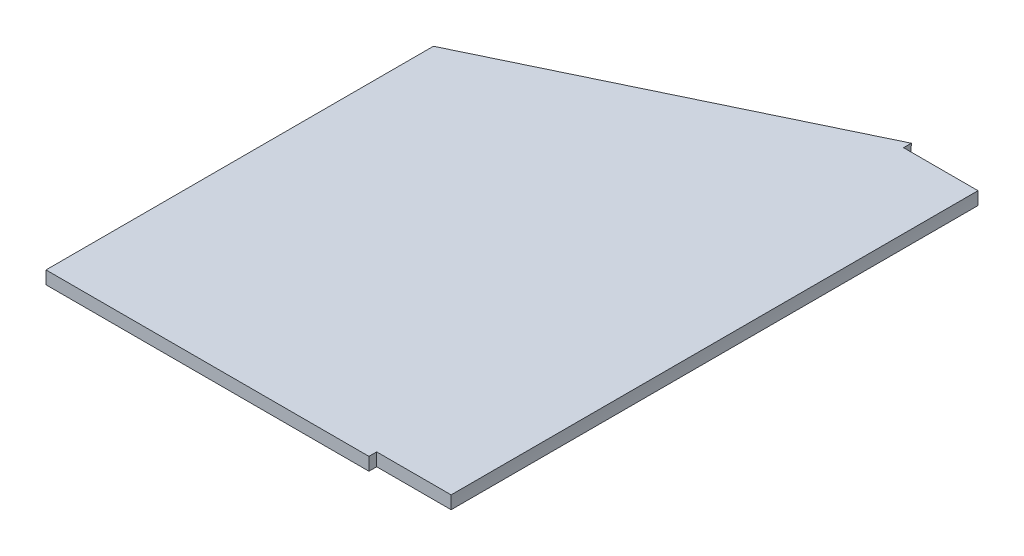
ISO-10303-21;
HEADER;
FILE_DESCRIPTION(('STEP AP214'),'2;1');
FILE_NAME('part.step','',(''),(''),'','','');
FILE_SCHEMA(('AUTOMOTIVE_DESIGN { 1 0 10303 214 1 1 1 1 }'));
ENDSEC;
DATA;
#1=APPLICATION_CONTEXT('core data for automotive mechanical design processes');
#2=APPLICATION_PROTOCOL_DEFINITION('international standard','automotive_design',2000,#1);
#3=PRODUCT_CONTEXT('',#1,'mechanical');
#4=PRODUCT('Part','Part','',(#3));
#5=PRODUCT_RELATED_PRODUCT_CATEGORY('part','',(#4));
#6=PRODUCT_DEFINITION_FORMATION('','',#4);
#7=PRODUCT_DEFINITION_CONTEXT('part definition',#1,'design');
#8=PRODUCT_DEFINITION('design','',#6,#7);
#9=PRODUCT_DEFINITION_SHAPE('','',#8);
#10=(LENGTH_UNIT() NAMED_UNIT(*) SI_UNIT(.MILLI.,.METRE.));
#11=(NAMED_UNIT(*) PLANE_ANGLE_UNIT() SI_UNIT($,.RADIAN.));
#12=(NAMED_UNIT(*) SI_UNIT($,.STERADIAN.) SOLID_ANGLE_UNIT());
#13=UNCERTAINTY_MEASURE_WITH_UNIT(LENGTH_MEASURE(1.E-05),#10,'distance_accuracy_value','');
#14=(GEOMETRIC_REPRESENTATION_CONTEXT(3) GLOBAL_UNCERTAINTY_ASSIGNED_CONTEXT((#13)) GLOBAL_UNIT_ASSIGNED_CONTEXT((#10,
#11,#12)) REPRESENTATION_CONTEXT('',''));
#15=CARTESIAN_POINT('',(0.,0.,0.));
#16=DIRECTION('',(0.,0.,1.));
#17=DIRECTION('',(1.,0.,0.));
#18=AXIS2_PLACEMENT_3D('',#15,#16,#17);
#19=CARTESIAN_POINT('',(80.75,0.,0.));
#20=DIRECTION('',(0.,0.,-1.));
#21=DIRECTION('',(-1.,0.,0.));
#22=AXIS2_PLACEMENT_3D('',#19,#20,#21);
#23=CYLINDRICAL_SURFACE('',#22,51.95);
#24=CARTESIAN_POINT('',(80.75,0.,-3.));
#25=DIRECTION('',(0.,0.,1.));
#26=DIRECTION('',(1.,0.,0.));
#27=AXIS2_PLACEMENT_3D('',#24,#25,#26);
#28=CIRCLE('',#27,51.95);
#29=CARTESIAN_POINT('',(28.8601888613959,-2.5,-3.));
#30=VERTEX_POINT('',#29);
#31=CARTESIAN_POINT('',(28.8601888613959,2.5,-3.));
#32=VERTEX_POINT('',#31);
#33=EDGE_CURVE('E52',#30,#32,#28,.F.);
#34=ORIENTED_EDGE('',*,*,#33,.F.);
#35=DIRECTION('',(0.,0.,-1.));
#36=VECTOR('',#35,1.);
#37=CARTESIAN_POINT('',(28.8601888613959,-2.5,0.));
#38=LINE('',#37,#36);
#39=CARTESIAN_POINT('',(28.8601888613959,-2.5,-207.));
#40=VERTEX_POINT('',#39);
#41=EDGE_CURVE('E167',#40,#30,#38,.F.);
#42=ORIENTED_EDGE('',*,*,#41,.F.);
#43=CARTESIAN_POINT('',(80.75,0.,-207.));
#44=DIRECTION('',(0.,0.,-1.));
#45=DIRECTION('',(-1.,0.,0.));
#46=AXIS2_PLACEMENT_3D('',#43,#44,#45);
#47=CIRCLE('',#46,51.95);
#48=CARTESIAN_POINT('',(28.8601888613959,2.5,-207.));
#49=VERTEX_POINT('',#48);
#50=EDGE_CURVE('E160',#49,#40,#47,.F.);
#51=ORIENTED_EDGE('',*,*,#50,.F.);
#52=DIRECTION('',(0.,0.,-1.));
#53=VECTOR('',#52,1.);
#54=CARTESIAN_POINT('',(28.8601888613959,2.5,0.));
#55=LINE('',#54,#53);
#56=EDGE_CURVE('E153',#49,#32,#55,.F.);
#57=ORIENTED_EDGE('',*,*,#56,.T.);
#58=EDGE_LOOP('',(#34,#42,#51,#57));
#59=FACE_BOUND('',#58,.T.);
#60=ADVANCED_FACE('F37',(#59),#23,.F.);
#61=CARTESIAN_POINT('',(0.,-2.5,-210.));
#62=DIRECTION('',(0.,0.,-1.));
#63=DIRECTION('',(-1.,0.,0.));
#64=AXIS2_PLACEMENT_3D('',#61,#62,#63);
#65=PLANE('',#64);
#66=CARTESIAN_POINT('',(80.75,0.,-210.));
#67=DIRECTION('',(0.,0.,-1.));
#68=DIRECTION('',(-1.,0.,0.));
#69=AXIS2_PLACEMENT_3D('',#66,#67,#68);
#70=CIRCLE('',#69,80.75);
#71=CARTESIAN_POINT('',(0.,0.,-210.));
#72=VERTEX_POINT('',#71);
#73=CARTESIAN_POINT('',(0.0387089683233921,2.5,-210.));
#74=VERTEX_POINT('',#73);
#75=EDGE_CURVE('E198',#72,#74,#70,.T.);
#76=ORIENTED_EDGE('',*,*,#75,.F.);
#77=DIRECTION('',(0.,1.,0.));
#78=VECTOR('',#77,1.);
#79=CARTESIAN_POINT('',(0.,-2.5,-210.));
#80=LINE('',#79,#78);
#81=CARTESIAN_POINT('',(0.,2.5,-210.));
#82=VERTEX_POINT('',#81);
#83=EDGE_CURVE('E154',#72,#82,#80,.T.);
#84=ORIENTED_EDGE('',*,*,#83,.T.);
#85=DIRECTION('',(-1.,0.,0.));
#86=VECTOR('',#85,1.);
#87=CARTESIAN_POINT('',(0.,2.5,-210.));
#88=LINE('',#87,#86);
#89=EDGE_CURVE('E132',#74,#82,#88,.T.);
#90=ORIENTED_EDGE('',*,*,#89,.F.);
#91=EDGE_LOOP('',(#76,#84,#90));
#92=FACE_BOUND('',#91,.T.);
#93=ADVANCED_FACE('F207',(#92),#65,.T.);
#94=CARTESIAN_POINT('',(0.,-2.5,-210.));
#95=DIRECTION('',(-0.432731067584771,0.,-0.901523057468274));
#96=DIRECTION('',(-0.901523057468274,0.,0.432731067584771));
#97=AXIS2_PLACEMENT_3D('',#94,#95,#96);
#98=PLANE('',#97);
#99=DIRECTION('',(0.,1.,0.));
#100=VECTOR('',#99,1.);
#101=CARTESIAN_POINT('',(-125.,-2.5,-150.));
#102=LINE('',#101,#100);
#103=CARTESIAN_POINT('',(-125.,-2.5,-150.));
#104=VERTEX_POINT('',#103);
#105=CARTESIAN_POINT('',(-125.,2.5,-150.));
#106=VERTEX_POINT('',#105);
#107=EDGE_CURVE('E149',#104,#106,#102,.T.);
#108=ORIENTED_EDGE('',*,*,#107,.T.);
#109=DIRECTION('',(-0.901523057468274,0.,0.432731067584771));
#110=VECTOR('',#109,1.);
#111=CARTESIAN_POINT('',(0.,2.5,-210.));
#112=LINE('',#111,#110);
#113=EDGE_CURVE('E137',#82,#106,#112,.T.);
#114=ORIENTED_EDGE('',*,*,#113,.F.);
#115=ORIENTED_EDGE('',*,*,#83,.F.);
#116=CARTESIAN_POINT('',(0.,-2.5,-210.));
#117=VERTEX_POINT('',#116);
#118=EDGE_CURVE('E150',#117,#72,#80,.T.);
#119=ORIENTED_EDGE('',*,*,#118,.F.);
#120=DIRECTION('',(-0.901523057468274,0.,0.432731067584771));
#121=VECTOR('',#120,1.);
#122=CARTESIAN_POINT('',(0.,-2.5,-210.));
#123=LINE('',#122,#121);
#124=EDGE_CURVE('E135',#117,#104,#123,.T.);
#125=ORIENTED_EDGE('',*,*,#124,.T.);
#126=EDGE_LOOP('',(#108,#114,#115,#119,#125));
#127=FACE_BOUND('',#126,.T.);
#128=ADVANCED_FACE('F39',(#127),#98,.T.);
#129=CARTESIAN_POINT('',(0.0387089683233921,-2.5,-210.));
#130=VERTEX_POINT('',#129);
#131=EDGE_CURVE('E196',#130,#72,#70,.T.);
#132=ORIENTED_EDGE('',*,*,#131,.F.);
#133=DIRECTION('',(-1.,0.,0.));
#134=VECTOR('',#133,1.);
#135=CARTESIAN_POINT('',(0.,-2.5,-210.));
#136=LINE('',#135,#134);
#137=EDGE_CURVE('E147',#130,#117,#136,.T.);
#138=ORIENTED_EDGE('',*,*,#137,.T.);
#139=ORIENTED_EDGE('',*,*,#118,.T.);
#140=EDGE_LOOP('',(#132,#138,#139));
#141=FACE_BOUND('',#140,.T.);
#142=ADVANCED_FACE('F210',(#141),#65,.T.);
#143=CARTESIAN_POINT('',(0.,-2.5,0.));
#144=DIRECTION('',(0.,0.,1.));
#145=DIRECTION('',(1.,0.,0.));
#146=AXIS2_PLACEMENT_3D('',#143,#144,#145);
#147=PLANE('',#146);
#148=CARTESIAN_POINT('',(80.75,0.,0.));
#149=DIRECTION('',(0.,0.,1.));
#150=DIRECTION('',(1.,0.,0.));
#151=AXIS2_PLACEMENT_3D('',#148,#149,#150);
#152=CIRCLE('',#151,80.75);
#153=CARTESIAN_POINT('',(0.0387089683233921,2.5,0.));
#154=VERTEX_POINT('',#153);
#155=CARTESIAN_POINT('',(0.0387089683233921,-2.5,0.));
#156=VERTEX_POINT('',#155);
#157=EDGE_CURVE('E113',#154,#156,#152,.T.);
#158=ORIENTED_EDGE('',*,*,#157,.F.);
#159=DIRECTION('',(1.,0.,0.));
#160=VECTOR('',#159,1.);
#161=CARTESIAN_POINT('',(-125.,2.5,0.));
#162=LINE('',#161,#160);
#163=CARTESIAN_POINT('',(-125.,2.5,0.));
#164=VERTEX_POINT('',#163);
#165=EDGE_CURVE('E123',#164,#154,#162,.T.);
#166=ORIENTED_EDGE('',*,*,#165,.F.);
#167=DIRECTION('',(0.,1.,0.));
#168=VECTOR('',#167,1.);
#169=CARTESIAN_POINT('',(-125.,-2.5,0.));
#170=LINE('',#169,#168);
#171=CARTESIAN_POINT('',(-125.,-2.5,0.));
#172=VERTEX_POINT('',#171);
#173=EDGE_CURVE('E155',#172,#164,#170,.T.);
#174=ORIENTED_EDGE('',*,*,#173,.F.);
#175=DIRECTION('',(1.,0.,0.));
#176=VECTOR('',#175,1.);
#177=CARTESIAN_POINT('',(-125.,-2.5,0.));
#178=LINE('',#177,#176);
#179=EDGE_CURVE('E125',#172,#156,#178,.T.);
#180=ORIENTED_EDGE('',*,*,#179,.T.);
#181=EDGE_LOOP('',(#158,#166,#174,#180));
#182=FACE_BOUND('',#181,.T.);
#183=ADVANCED_FACE('F122',(#182),#147,.T.);
#184=CARTESIAN_POINT('',(-125.,-2.5,-150.));
#185=DIRECTION('',(-1.,0.,0.));
#186=DIRECTION('',(0.,0.,1.));
#187=AXIS2_PLACEMENT_3D('',#184,#185,#186);
#188=PLANE('',#187);
#189=ORIENTED_EDGE('',*,*,#173,.T.);
#190=DIRECTION('',(0.,0.,1.));
#191=VECTOR('',#190,1.);
#192=CARTESIAN_POINT('',(-125.,2.5,-150.));
#193=LINE('',#192,#191);
#194=EDGE_CURVE('E131',#106,#164,#193,.T.);
#195=ORIENTED_EDGE('',*,*,#194,.F.);
#196=ORIENTED_EDGE('',*,*,#107,.F.);
#197=DIRECTION('',(0.,0.,1.));
#198=VECTOR('',#197,1.);
#199=CARTESIAN_POINT('',(-125.,-2.5,-150.));
#200=LINE('',#199,#198);
#201=EDGE_CURVE('E143',#104,#172,#200,.T.);
#202=ORIENTED_EDGE('',*,*,#201,.T.);
#203=EDGE_LOOP('',(#189,#195,#196,#202));
#204=FACE_BOUND('',#203,.T.);
#205=ADVANCED_FACE('F193',(#204),#188,.T.);
#206=CARTESIAN_POINT('',(0.,-2.5,0.));
#207=DIRECTION('',(0.,1.,0.));
#208=DIRECTION('',(0.,0.,1.));
#209=AXIS2_PLACEMENT_3D('',#206,#207,#208);
#210=PLANE('',#209);
#211=DIRECTION('',(1.,0.,0.));
#212=VECTOR('',#211,1.);
#213=CARTESIAN_POINT('',(0.,-2.5,-3.));
#214=LINE('',#213,#212);
#215=CARTESIAN_POINT('',(0.0387089683233921,-2.5,-3.));
#216=VERTEX_POINT('',#215);
#217=EDGE_CURVE('E195',#216,#30,#214,.T.);
#218=ORIENTED_EDGE('',*,*,#217,.F.);
#219=DIRECTION('',(0.,0.,1.));
#220=VECTOR('',#219,1.);
#221=CARTESIAN_POINT('',(0.0387089683233921,-2.5,-3.));
#222=LINE('',#221,#220);
#223=EDGE_CURVE('E194',#216,#156,#222,.T.);
#224=ORIENTED_EDGE('',*,*,#223,.T.);
#225=ORIENTED_EDGE('',*,*,#179,.F.);
#226=ORIENTED_EDGE('',*,*,#201,.F.);
#227=ORIENTED_EDGE('',*,*,#124,.F.);
#228=ORIENTED_EDGE('',*,*,#137,.F.);
#229=DIRECTION('',(0.,0.,-1.));
#230=VECTOR('',#229,1.);
#231=CARTESIAN_POINT('',(0.0387089683233921,-2.5,-207.));
#232=LINE('',#231,#230);
#233=CARTESIAN_POINT('',(0.0387089683233921,-2.5,-207.));
#234=VERTEX_POINT('',#233);
#235=EDGE_CURVE('E177',#130,#234,#232,.F.);
#236=ORIENTED_EDGE('',*,*,#235,.T.);
#237=DIRECTION('',(-1.,0.,0.));
#238=VECTOR('',#237,1.);
#239=CARTESIAN_POINT('',(0.,-2.5,-207.));
#240=LINE('',#239,#238);
#241=EDGE_CURVE('E170',#40,#234,#240,.T.);
#242=ORIENTED_EDGE('',*,*,#241,.F.);
#243=ORIENTED_EDGE('',*,*,#41,.T.);
#244=EDGE_LOOP('',(#218,#224,#225,#226,#227,#228,#236,#242,#243));
#245=FACE_BOUND('',#244,.T.);
#246=ADVANCED_FACE('F175',(#245),#210,.F.);
#247=CARTESIAN_POINT('',(0.,2.5,0.));
#248=DIRECTION('',(0.,1.,0.));
#249=DIRECTION('',(0.,0.,1.));
#250=AXIS2_PLACEMENT_3D('',#247,#248,#249);
#251=PLANE('',#250);
#252=DIRECTION('',(0.,0.,1.));
#253=VECTOR('',#252,1.);
#254=CARTESIAN_POINT('',(0.0387089683233921,2.5,-3.));
#255=LINE('',#254,#253);
#256=CARTESIAN_POINT('',(0.0387089683233921,2.5,-3.));
#257=VERTEX_POINT('',#256);
#258=EDGE_CURVE('E11',#257,#154,#255,.T.);
#259=ORIENTED_EDGE('',*,*,#258,.F.);
#260=DIRECTION('',(1.,0.,0.));
#261=VECTOR('',#260,1.);
#262=CARTESIAN_POINT('',(0.,2.5,-3.));
#263=LINE('',#262,#261);
#264=EDGE_CURVE('E45',#257,#32,#263,.T.);
#265=ORIENTED_EDGE('',*,*,#264,.T.);
#266=ORIENTED_EDGE('',*,*,#56,.F.);
#267=DIRECTION('',(-1.,0.,0.));
#268=VECTOR('',#267,1.);
#269=CARTESIAN_POINT('',(0.,2.5,-207.));
#270=LINE('',#269,#268);
#271=CARTESIAN_POINT('',(0.0387089683233921,2.5,-207.));
#272=VERTEX_POINT('',#271);
#273=EDGE_CURVE('E60',#49,#272,#270,.T.);
#274=ORIENTED_EDGE('',*,*,#273,.T.);
#275=DIRECTION('',(0.,0.,-1.));
#276=VECTOR('',#275,1.);
#277=CARTESIAN_POINT('',(0.0387089683233921,2.5,-207.));
#278=LINE('',#277,#276);
#279=EDGE_CURVE('E162',#74,#272,#278,.F.);
#280=ORIENTED_EDGE('',*,*,#279,.F.);
#281=ORIENTED_EDGE('',*,*,#89,.T.);
#282=ORIENTED_EDGE('',*,*,#113,.T.);
#283=ORIENTED_EDGE('',*,*,#194,.T.);
#284=ORIENTED_EDGE('',*,*,#165,.T.);
#285=EDGE_LOOP('',(#259,#265,#266,#274,#280,#281,#282,#283,#284));
#286=FACE_BOUND('',#285,.T.);
#287=ADVANCED_FACE('F128',(#286),#251,.T.);
#288=CARTESIAN_POINT('',(80.75,0.,-207.));
#289=DIRECTION('',(0.,0.,-1.));
#290=DIRECTION('',(-1.,0.,0.));
#291=AXIS2_PLACEMENT_3D('',#288,#289,#290);
#292=CYLINDRICAL_SURFACE('',#291,80.75);
#293=ORIENTED_EDGE('',*,*,#131,.T.);
#294=ORIENTED_EDGE('',*,*,#75,.T.);
#295=ORIENTED_EDGE('',*,*,#279,.T.);
#296=CARTESIAN_POINT('',(80.75,0.,-207.));
#297=DIRECTION('',(0.,0.,-1.));
#298=DIRECTION('',(-1.,0.,0.));
#299=AXIS2_PLACEMENT_3D('',#296,#297,#298);
#300=CIRCLE('',#299,80.75);
#301=EDGE_CURVE('E180',#234,#272,#300,.T.);
#302=ORIENTED_EDGE('',*,*,#301,.F.);
#303=ORIENTED_EDGE('',*,*,#235,.F.);
#304=EDGE_LOOP('',(#293,#294,#295,#302,#303));
#305=FACE_BOUND('',#304,.T.);
#306=ADVANCED_FACE('F204',(#305),#292,.F.);
#307=CARTESIAN_POINT('',(80.75,0.,-207.));
#308=DIRECTION('',(0.,0.,-1.));
#309=DIRECTION('',(-1.,0.,0.));
#310=AXIS2_PLACEMENT_3D('',#307,#308,#309);
#311=PLANE('',#310);
#312=ORIENTED_EDGE('',*,*,#241,.T.);
#313=ORIENTED_EDGE('',*,*,#301,.T.);
#314=ORIENTED_EDGE('',*,*,#273,.F.);
#315=ORIENTED_EDGE('',*,*,#50,.T.);
#316=EDGE_LOOP('',(#312,#313,#314,#315));
#317=FACE_BOUND('',#316,.T.);
#318=ADVANCED_FACE('F169',(#317),#311,.T.);
#319=CARTESIAN_POINT('',(80.75,0.,-3.));
#320=DIRECTION('',(0.,0.,1.));
#321=DIRECTION('',(1.,0.,0.));
#322=AXIS2_PLACEMENT_3D('',#319,#320,#321);
#323=CYLINDRICAL_SURFACE('',#322,80.75);
#324=CARTESIAN_POINT('',(80.75,0.,-3.));
#325=DIRECTION('',(0.,0.,1.));
#326=DIRECTION('',(1.,0.,0.));
#327=AXIS2_PLACEMENT_3D('',#324,#325,#326);
#328=CIRCLE('',#327,80.75);
#329=EDGE_CURVE('E116',#257,#216,#328,.T.);
#330=ORIENTED_EDGE('',*,*,#329,.F.);
#331=ORIENTED_EDGE('',*,*,#258,.T.);
#332=ORIENTED_EDGE('',*,*,#157,.T.);
#333=ORIENTED_EDGE('',*,*,#223,.F.);
#334=EDGE_LOOP('',(#330,#331,#332,#333));
#335=FACE_BOUND('',#334,.T.);
#336=ADVANCED_FACE('F112',(#335),#323,.F.);
#337=CARTESIAN_POINT('',(80.75,0.,-3.));
#338=DIRECTION('',(0.,0.,1.));
#339=DIRECTION('',(1.,0.,0.));
#340=AXIS2_PLACEMENT_3D('',#337,#338,#339);
#341=PLANE('',#340);
#342=ORIENTED_EDGE('',*,*,#217,.T.);
#343=ORIENTED_EDGE('',*,*,#33,.T.);
#344=ORIENTED_EDGE('',*,*,#264,.F.);
#345=ORIENTED_EDGE('',*,*,#329,.T.);
#346=EDGE_LOOP('',(#342,#343,#344,#345));
#347=FACE_BOUND('',#346,.T.);
#348=ADVANCED_FACE('F240',(#347),#341,.T.);
#349=CLOSED_SHELL('',(#60,#93,#128,#142,#183,#205,#246,#287,#306,#318,#336,#348));
#350=MANIFOLD_SOLID_BREP('B2',#349);
#351=ADVANCED_BREP_SHAPE_REPRESENTATION('',(#18,#350),#14);
#352=SHAPE_DEFINITION_REPRESENTATION(#9,#351);
ENDSEC;
END-ISO-10303-21;
